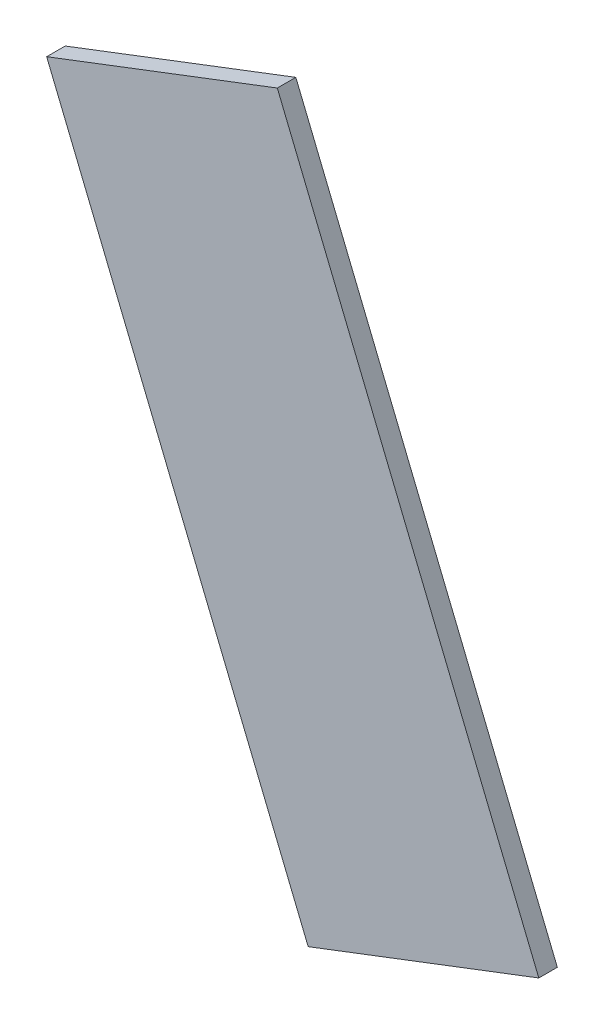
ISO-10303-21;
HEADER;
FILE_DESCRIPTION(('STEP AP214'),'2;1');
FILE_NAME('part.step','',(''),(''),'','','');
FILE_SCHEMA(('AUTOMOTIVE_DESIGN { 1 0 10303 214 1 1 1 1 }'));
ENDSEC;
DATA;
#1=APPLICATION_CONTEXT('core data for automotive mechanical design processes');
#2=APPLICATION_PROTOCOL_DEFINITION('international standard','automotive_design',2000,#1);
#3=PRODUCT_CONTEXT('',#1,'mechanical');
#4=PRODUCT('Part','Part','',(#3));
#5=PRODUCT_RELATED_PRODUCT_CATEGORY('part','',(#4));
#6=PRODUCT_DEFINITION_FORMATION('','',#4);
#7=PRODUCT_DEFINITION_CONTEXT('part definition',#1,'design');
#8=PRODUCT_DEFINITION('design','',#6,#7);
#9=PRODUCT_DEFINITION_SHAPE('','',#8);
#10=(LENGTH_UNIT() NAMED_UNIT(*) SI_UNIT(.MILLI.,.METRE.));
#11=(NAMED_UNIT(*) PLANE_ANGLE_UNIT() SI_UNIT($,.RADIAN.));
#12=(NAMED_UNIT(*) SI_UNIT($,.STERADIAN.) SOLID_ANGLE_UNIT());
#13=UNCERTAINTY_MEASURE_WITH_UNIT(LENGTH_MEASURE(1.E-05),#10,'distance_accuracy_value','');
#14=(GEOMETRIC_REPRESENTATION_CONTEXT(3) GLOBAL_UNCERTAINTY_ASSIGNED_CONTEXT((#13)) GLOBAL_UNIT_ASSIGNED_CONTEXT((#10,
#11,#12)) REPRESENTATION_CONTEXT('',''));
#15=CARTESIAN_POINT('',(0.,0.,0.));
#16=DIRECTION('',(0.,0.,1.));
#17=DIRECTION('',(1.,0.,0.));
#18=AXIS2_PLACEMENT_3D('',#15,#16,#17);
#19=CARTESIAN_POINT('',(-59.1187163407228,54.6412092248273,3.));
#20=DIRECTION('',(0.357137466266591,-0.934051834851085,0.));
#21=DIRECTION('',(0.934051834851085,0.357137466266591,0.));
#22=AXIS2_PLACEMENT_3D('',#19,#20,#21);
#23=PLANE('',#22);
#24=DIRECTION('',(-0.934051834851085,-0.357137466266591,0.));
#25=VECTOR('',#24,1.);
#26=CARTESIAN_POINT('',(-59.1187163407228,54.6412092248273,0.));
#27=LINE('',#26,#25);
#28=CARTESIAN_POINT('',(-21.7566429466793,68.9267078754909,0.));
#29=VERTEX_POINT('',#28);
#30=CARTESIAN_POINT('',(-59.1187163407228,54.6412092248273,0.));
#31=VERTEX_POINT('',#30);
#32=EDGE_CURVE('E109',#29,#31,#27,.T.);
#33=ORIENTED_EDGE('',*,*,#32,.T.);
#34=DIRECTION('',(0.,0.,-1.));
#35=VECTOR('',#34,1.);
#36=CARTESIAN_POINT('',(-59.1187163407228,54.6412092248273,3.));
#37=LINE('',#36,#35);
#38=CARTESIAN_POINT('',(-59.1187163407228,54.6412092248273,3.));
#39=VERTEX_POINT('',#38);
#40=EDGE_CURVE('E11',#39,#31,#37,.T.);
#41=ORIENTED_EDGE('',*,*,#40,.F.);
#42=DIRECTION('',(-0.934051834851085,-0.357137466266591,0.));
#43=VECTOR('',#42,1.);
#44=CARTESIAN_POINT('',(-59.1187163407228,54.6412092248273,3.));
#45=LINE('',#44,#43);
#46=CARTESIAN_POINT('',(-21.7566429466793,68.9267078754909,3.));
#47=VERTEX_POINT('',#46);
#48=EDGE_CURVE('E93',#47,#39,#45,.T.);
#49=ORIENTED_EDGE('',*,*,#48,.F.);
#50=DIRECTION('',(0.,0.,-1.));
#51=VECTOR('',#50,1.);
#52=CARTESIAN_POINT('',(-21.7566429466793,68.9267078754909,3.));
#53=LINE('',#52,#51);
#54=EDGE_CURVE('E105',#47,#29,#53,.T.);
#55=ORIENTED_EDGE('',*,*,#54,.T.);
#56=EDGE_LOOP('',(#33,#41,#49,#55));
#57=FACE_BOUND('',#56,.T.);
#58=ADVANCED_FACE('F41',(#57),#23,.F.);
#59=CARTESIAN_POINT('',(-16.7551707290494,-49.0377664800265,3.));
#60=DIRECTION('',(0.925705140221909,0.378245942961369,0.));
#61=DIRECTION('',(-0.37824594296137,0.925705140221909,0.));
#62=AXIS2_PLACEMENT_3D('',#59,#60,#61);
#63=PLANE('',#62);
#64=DIRECTION('',(0.37824594296137,-0.925705140221909,0.));
#65=VECTOR('',#64,1.);
#66=CARTESIAN_POINT('',(-16.7551707290494,-49.0377664800265,0.));
#67=LINE('',#66,#65);
#68=CARTESIAN_POINT('',(-16.7551707290494,-49.0377664800265,0.));
#69=VERTEX_POINT('',#68);
#70=EDGE_CURVE('E98',#31,#69,#67,.T.);
#71=ORIENTED_EDGE('',*,*,#70,.T.);
#72=DIRECTION('',(0.,0.,-1.));
#73=VECTOR('',#72,1.);
#74=CARTESIAN_POINT('',(-16.7551707290494,-49.0377664800265,3.));
#75=LINE('',#74,#73);
#76=CARTESIAN_POINT('',(-16.7551707290494,-49.0377664800265,3.));
#77=VERTEX_POINT('',#76);
#78=EDGE_CURVE('E50',#77,#69,#75,.T.);
#79=ORIENTED_EDGE('',*,*,#78,.F.);
#80=DIRECTION('',(0.37824594296137,-0.925705140221909,0.));
#81=VECTOR('',#80,1.);
#82=CARTESIAN_POINT('',(-16.7551707290494,-49.0377664800265,3.));
#83=LINE('',#82,#81);
#84=EDGE_CURVE('E88',#39,#77,#83,.T.);
#85=ORIENTED_EDGE('',*,*,#84,.F.);
#86=ORIENTED_EDGE('',*,*,#40,.T.);
#87=EDGE_LOOP('',(#71,#79,#85,#86));
#88=FACE_BOUND('',#87,.T.);
#89=ADVANCED_FACE('F97',(#88),#63,.F.);
#90=CARTESIAN_POINT('',(20.6069026649941,-34.7522678293629,3.));
#91=DIRECTION('',(-0.357137466266591,0.934051834851085,0.));
#92=DIRECTION('',(-0.934051834851086,-0.357137466266591,0.));
#93=AXIS2_PLACEMENT_3D('',#90,#91,#92);
#94=PLANE('',#93);
#95=DIRECTION('',(0.934051834851085,0.357137466266591,0.));
#96=VECTOR('',#95,1.);
#97=CARTESIAN_POINT('',(20.6069026649941,-34.7522678293629,0.));
#98=LINE('',#97,#96);
#99=CARTESIAN_POINT('',(20.6069026649941,-34.7522678293629,0.));
#100=VERTEX_POINT('',#99);
#101=EDGE_CURVE('E75',#69,#100,#98,.T.);
#102=ORIENTED_EDGE('',*,*,#101,.T.);
#103=DIRECTION('',(0.,0.,-1.));
#104=VECTOR('',#103,1.);
#105=CARTESIAN_POINT('',(20.6069026649941,-34.7522678293629,3.));
#106=LINE('',#105,#104);
#107=CARTESIAN_POINT('',(20.6069026649941,-34.7522678293629,3.));
#108=VERTEX_POINT('',#107);
#109=EDGE_CURVE('E100',#108,#100,#106,.T.);
#110=ORIENTED_EDGE('',*,*,#109,.F.);
#111=DIRECTION('',(0.934051834851085,0.357137466266591,0.));
#112=VECTOR('',#111,1.);
#113=CARTESIAN_POINT('',(20.6069026649941,-34.7522678293629,3.));
#114=LINE('',#113,#112);
#115=EDGE_CURVE('E91',#77,#108,#114,.T.);
#116=ORIENTED_EDGE('',*,*,#115,.F.);
#117=ORIENTED_EDGE('',*,*,#78,.T.);
#118=EDGE_LOOP('',(#102,#110,#116,#117));
#119=FACE_BOUND('',#118,.T.);
#120=ADVANCED_FACE('F101',(#119),#94,.F.);
#121=CARTESIAN_POINT('',(-21.7566429466793,68.9267078754909,3.));
#122=DIRECTION('',(-0.925705140221909,-0.37824594296137,0.));
#123=DIRECTION('',(0.37824594296137,-0.925705140221909,0.));
#124=AXIS2_PLACEMENT_3D('',#121,#122,#123);
#125=PLANE('',#124);
#126=DIRECTION('',(-0.37824594296137,0.925705140221909,0.));
#127=VECTOR('',#126,1.);
#128=CARTESIAN_POINT('',(-21.7566429466793,68.9267078754909,0.));
#129=LINE('',#128,#127);
#130=EDGE_CURVE('E81',#100,#29,#129,.T.);
#131=ORIENTED_EDGE('',*,*,#130,.T.);
#132=ORIENTED_EDGE('',*,*,#54,.F.);
#133=DIRECTION('',(-0.37824594296137,0.925705140221909,0.));
#134=VECTOR('',#133,1.);
#135=CARTESIAN_POINT('',(-21.7566429466793,68.9267078754909,3.));
#136=LINE('',#135,#134);
#137=EDGE_CURVE('E58',#108,#47,#136,.T.);
#138=ORIENTED_EDGE('',*,*,#137,.F.);
#139=ORIENTED_EDGE('',*,*,#109,.T.);
#140=EDGE_LOOP('',(#131,#132,#138,#139));
#141=FACE_BOUND('',#140,.T.);
#142=ADVANCED_FACE('F122',(#141),#125,.F.);
#143=CARTESIAN_POINT('',(0.,0.,3.));
#144=DIRECTION('',(0.,0.,-1.));
#145=DIRECTION('',(-1.,0.,0.));
#146=AXIS2_PLACEMENT_3D('',#143,#144,#145);
#147=PLANE('',#146);
#148=ORIENTED_EDGE('',*,*,#48,.T.);
#149=ORIENTED_EDGE('',*,*,#84,.T.);
#150=ORIENTED_EDGE('',*,*,#115,.T.);
#151=ORIENTED_EDGE('',*,*,#137,.T.);
#152=EDGE_LOOP('',(#148,#149,#150,#151));
#153=FACE_BOUND('',#152,.T.);
#154=ADVANCED_FACE('F89',(#153),#147,.F.);
#155=CARTESIAN_POINT('',(0.,0.,0.));
#156=DIRECTION('',(0.,0.,-1.));
#157=DIRECTION('',(-1.,0.,0.));
#158=AXIS2_PLACEMENT_3D('',#155,#156,#157);
#159=PLANE('',#158);
#160=ORIENTED_EDGE('',*,*,#32,.F.);
#161=ORIENTED_EDGE('',*,*,#130,.F.);
#162=ORIENTED_EDGE('',*,*,#101,.F.);
#163=ORIENTED_EDGE('',*,*,#70,.F.);
#164=EDGE_LOOP('',(#160,#161,#162,#163));
#165=FACE_BOUND('',#164,.T.);
#166=ADVANCED_FACE('F125',(#165),#159,.T.);
#167=CLOSED_SHELL('',(#58,#89,#120,#142,#154,#166));
#168=MANIFOLD_SOLID_BREP('B2',#167);
#169=ADVANCED_BREP_SHAPE_REPRESENTATION('',(#18,#168),#14);
#170=SHAPE_DEFINITION_REPRESENTATION(#9,#169);
ENDSEC;
END-ISO-10303-21;
